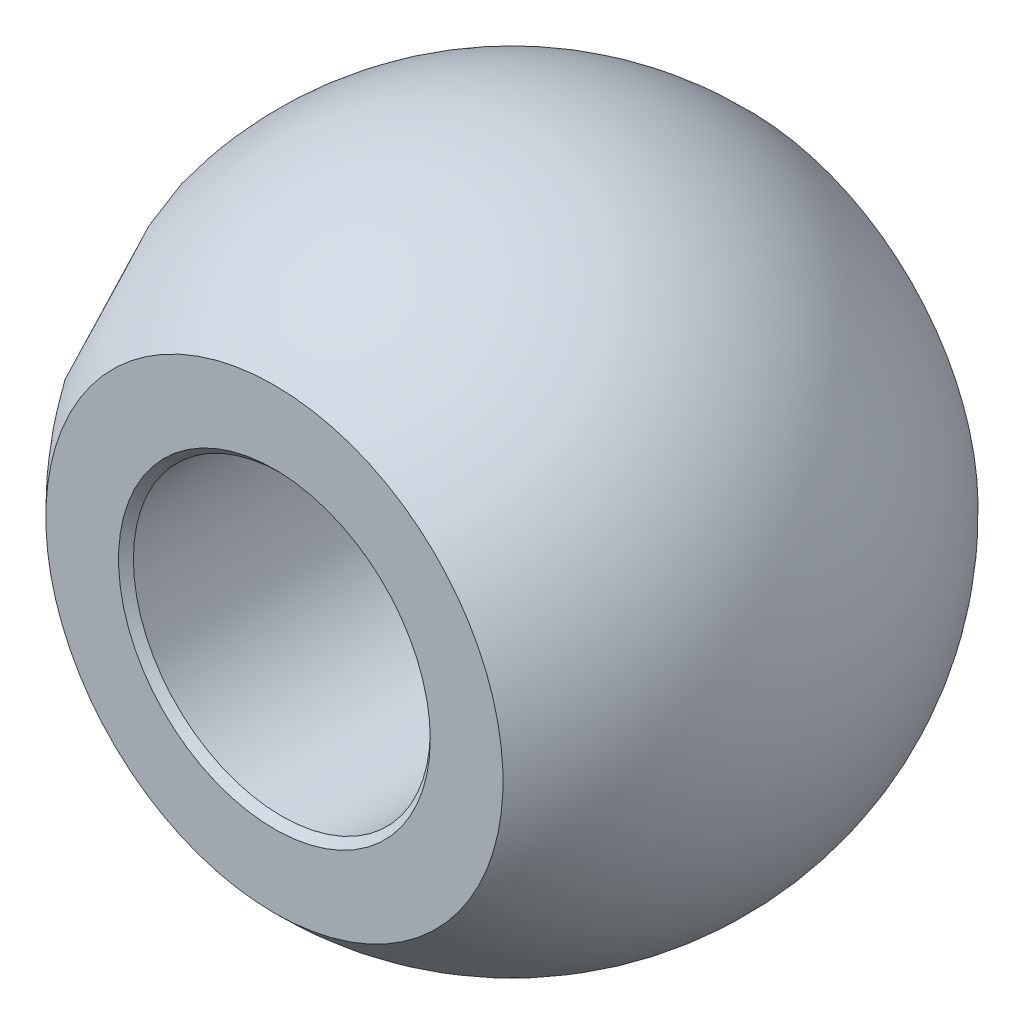
ISO-10303-21;
HEADER;
FILE_DESCRIPTION(('STEP AP214'),'2;1');
FILE_NAME('part.step','',(''),(''),'','','');
FILE_SCHEMA(('AUTOMOTIVE_DESIGN { 1 0 10303 214 1 1 1 1 }'));
ENDSEC;
DATA;
#1=APPLICATION_CONTEXT('core data for automotive mechanical design processes');
#2=APPLICATION_PROTOCOL_DEFINITION('international standard','automotive_design',2000,#1);
#3=PRODUCT_CONTEXT('',#1,'mechanical');
#4=PRODUCT('Part','Part','',(#3));
#5=PRODUCT_RELATED_PRODUCT_CATEGORY('part','',(#4));
#6=PRODUCT_DEFINITION_FORMATION('','',#4);
#7=PRODUCT_DEFINITION_CONTEXT('part definition',#1,'design');
#8=PRODUCT_DEFINITION('design','',#6,#7);
#9=PRODUCT_DEFINITION_SHAPE('','',#8);
#10=(LENGTH_UNIT() NAMED_UNIT(*) SI_UNIT(.MILLI.,.METRE.));
#11=(NAMED_UNIT(*) PLANE_ANGLE_UNIT() SI_UNIT($,.RADIAN.));
#12=(NAMED_UNIT(*) SI_UNIT($,.STERADIAN.) SOLID_ANGLE_UNIT());
#13=UNCERTAINTY_MEASURE_WITH_UNIT(LENGTH_MEASURE(1.E-05),#10,'distance_accuracy_value','');
#14=(GEOMETRIC_REPRESENTATION_CONTEXT(3) GLOBAL_UNCERTAINTY_ASSIGNED_CONTEXT((#13)) GLOBAL_UNIT_ASSIGNED_CONTEXT((#10,
#11,#12)) REPRESENTATION_CONTEXT('',''));
#15=CARTESIAN_POINT('',(0.,0.,0.));
#16=DIRECTION('',(0.,0.,1.));
#17=DIRECTION('',(1.,0.,0.));
#18=AXIS2_PLACEMENT_3D('',#15,#16,#17);
#19=CARTESIAN_POINT('',(0.,0.,4.));
#20=DIRECTION('',(0.,0.,1.));
#21=DIRECTION('',(1.,0.,0.));
#22=AXIS2_PLACEMENT_3D('',#19,#20,#21);
#23=CYLINDRICAL_SURFACE('',#22,2.5);
#24=CARTESIAN_POINT('',(0.,0.,3.87499999993679));
#25=DIRECTION('',(0.,0.,1.));
#26=DIRECTION('',(1.,0.,0.));
#27=AXIS2_PLACEMENT_3D('',#24,#25,#26);
#28=CIRCLE('',#27,2.49999999999773);
#29=CARTESIAN_POINT('',(2.49999999999773,0.,3.87499999993679));
#30=VERTEX_POINT('',#29);
#31=EDGE_CURVE('E42',#30,#30,#28,.T.);
#32=ORIENTED_EDGE('',*,*,#31,.T.);
#33=EDGE_LOOP('',(#32));
#34=FACE_BOUND('',#33,.T.);
#35=CARTESIAN_POINT('',(0.,0.,-3.87499999993679));
#36=DIRECTION('',(0.,0.,-1.));
#37=DIRECTION('',(-1.,0.,0.));
#38=AXIS2_PLACEMENT_3D('',#35,#36,#37);
#39=CIRCLE('',#38,2.49999999999773);
#40=CARTESIAN_POINT('',(-2.49999999999773,0.,-3.87499999993679));
#41=VERTEX_POINT('',#40);
#42=EDGE_CURVE('E38',#41,#41,#39,.T.);
#43=ORIENTED_EDGE('',*,*,#42,.T.);
#44=EDGE_LOOP('',(#43));
#45=FACE_BOUND('',#44,.T.);
#46=ADVANCED_FACE('F16',(#34,#45),#23,.F.);
#47=CARTESIAN_POINT('',(0.,0.,4.00000000007594));
#48=DIRECTION('',(0.,0.,1.));
#49=DIRECTION('',(1.,0.,0.));
#50=AXIS2_PLACEMENT_3D('',#47,#48,#49);
#51=CONICAL_SURFACE('',#50,2.62499999990951,0.785398162487954);
#52=ORIENTED_EDGE('',*,*,#31,.F.);
#53=EDGE_LOOP('',(#52));
#54=FACE_BOUND('',#53,.T.);
#55=CARTESIAN_POINT('',(0.,0.,4.00000000007594));
#56=DIRECTION('',(0.,0.,1.));
#57=DIRECTION('',(1.,0.,0.));
#58=AXIS2_PLACEMENT_3D('',#55,#56,#57);
#59=CIRCLE('',#58,2.62499999990951);
#60=CARTESIAN_POINT('',(2.62499999990951,0.,4.00000000007594));
#61=VERTEX_POINT('',#60);
#62=EDGE_CURVE('E20',#61,#61,#59,.F.);
#63=ORIENTED_EDGE('',*,*,#62,.F.);
#64=EDGE_LOOP('',(#63));
#65=FACE_BOUND('',#64,.T.);
#66=ADVANCED_FACE('F52',(#54,#65),#51,.F.);
#67=CARTESIAN_POINT('',(0.,0.,-4.00000000007594));
#68=DIRECTION('',(0.,0.,-1.));
#69=DIRECTION('',(-1.,0.,0.));
#70=AXIS2_PLACEMENT_3D('',#67,#68,#69);
#71=CONICAL_SURFACE('',#70,2.62499999990951,0.785398162487954);
#72=ORIENTED_EDGE('',*,*,#42,.F.);
#73=EDGE_LOOP('',(#72));
#74=FACE_BOUND('',#73,.T.);
#75=CARTESIAN_POINT('',(0.,0.,-4.00000000007594));
#76=DIRECTION('',(0.,0.,-1.));
#77=DIRECTION('',(-1.,0.,0.));
#78=AXIS2_PLACEMENT_3D('',#75,#76,#77);
#79=CIRCLE('',#78,2.62499999990951);
#80=CARTESIAN_POINT('',(-2.62499999990951,0.,-4.00000000007594));
#81=VERTEX_POINT('',#80);
#82=EDGE_CURVE('E29',#81,#81,#79,.F.);
#83=ORIENTED_EDGE('',*,*,#82,.F.);
#84=EDGE_LOOP('',(#83));
#85=FACE_BOUND('',#84,.T.);
#86=ADVANCED_FACE('F55',(#74,#85),#71,.F.);
#87=CARTESIAN_POINT('',(3.2375,0.,4.));
#88=DIRECTION('',(0.,0.,1.));
#89=DIRECTION('',(1.,0.,0.));
#90=AXIS2_PLACEMENT_3D('',#87,#88,#89);
#91=PLANE('',#90);
#92=ORIENTED_EDGE('',*,*,#62,.T.);
#93=EDGE_LOOP('',(#92));
#94=FACE_BOUND('',#93,.T.);
#95=CARTESIAN_POINT('',(1.20021180494145E-13,0.,4.));
#96=DIRECTION('',(0.,0.,1.));
#97=DIRECTION('',(1.,0.,0.));
#98=AXIS2_PLACEMENT_3D('',#95,#96,#97);
#99=CIRCLE('',#98,3.85000000000005);
#100=CARTESIAN_POINT('',(-3.09603122574186,2.28846906232771,4.));
#101=VERTEX_POINT('',#100);
#102=EDGE_CURVE('E24',#101,#101,#99,.F.);
#103=ORIENTED_EDGE('',*,*,#102,.F.);
#104=EDGE_LOOP('',(#103));
#105=FACE_BOUND('',#104,.T.);
#106=ADVANCED_FACE('F62',(#94,#105),#91,.T.);
#107=CARTESIAN_POINT('',(3.2375,0.,-4.));
#108=DIRECTION('',(0.,0.,-1.));
#109=DIRECTION('',(-1.,0.,0.));
#110=AXIS2_PLACEMENT_3D('',#107,#108,#109);
#111=PLANE('',#110);
#112=ORIENTED_EDGE('',*,*,#82,.T.);
#113=EDGE_LOOP('',(#112));
#114=FACE_BOUND('',#113,.T.);
#115=CARTESIAN_POINT('',(1.20021180494145E-13,0.,-4.));
#116=DIRECTION('',(0.,0.,-1.));
#117=DIRECTION('',(-1.,0.,0.));
#118=AXIS2_PLACEMENT_3D('',#115,#116,#117);
#119=CIRCLE('',#118,3.85000000000005);
#120=CARTESIAN_POINT('',(-1.65949466090485,-3.4739858189734,-4.));
#121=VERTEX_POINT('',#120);
#122=EDGE_CURVE('E10',#121,#121,#119,.F.);
#123=ORIENTED_EDGE('',*,*,#122,.F.);
#124=EDGE_LOOP('',(#123));
#125=FACE_BOUND('',#124,.T.);
#126=ADVANCED_FACE('F66',(#114,#125),#111,.T.);
#127=CARTESIAN_POINT('',(1.20021180494145E-13,0.,0.));
#128=DIRECTION('',(0.282924734195512,0.626301606135669,0.726429551252067));
#129=DIRECTION('',(-0.939271699416317,0.0275520774515117,0.34206659834554));
#130=AXIS2_PLACEMENT_3D('',#127,#128,#129);
#131=SPHERICAL_SURFACE('',#130,5.5518015094202);
#132=CARTESIAN_POINT('',(1.20021180494145E-13,0.,0.));
#133=DIRECTION('',(0.,0.,1.));
#134=DIRECTION('',(1.,0.,0.));
#135=AXIS2_PLACEMENT_3D('',#132,#133,#134);
#136=SPHERICAL_SURFACE('',#135,5.5518015094202);
#137=CARTESIAN_POINT('',(-3.09603122574186,2.28846906232771,4.));
#138=CARTESIAN_POINT('',(-3.19998646062144,2.22763184947655,3.95435465459594));
#139=CARTESIAN_POINT('',(-3.30143260323115,2.16494101472646,3.90546893304671));
#140=CARTESIAN_POINT('',(-3.49883640371181,2.0361686372723,3.8014772277288));
#141=CARTESIAN_POINT('',(-3.59479406158274,1.97008709456824,3.74637124396012));
#142=CARTESIAN_POINT('',(-3.7807505923868,1.83484983705009,3.6301995042742));
#143=CARTESIAN_POINT('',(-3.87074946531992,1.765694122236,3.56913374835695));
#144=CARTESIAN_POINT('',(-4.04435410367741,1.62464434296757,3.44133988638448));
#145=CARTESIAN_POINT('',(-4.12795986910177,1.55275027851323,3.37461178032925));
#146=CARTESIAN_POINT('',(-4.2883730208147,1.40657170424718,3.23581589785155));
#147=CARTESIAN_POINT('',(-4.36518040710326,1.33228719443547,3.16374812142907));
#148=CARTESIAN_POINT('',(-4.51162496198778,1.18168752556449,3.01462201530399));
#149=CARTESIAN_POINT('',(-4.58126213058374,1.10537236650522,2.93756368560139));
#150=CARTESIAN_POINT('',(-4.71302899693808,0.951080944208363,2.77882960192891));
#151=CARTESIAN_POINT('',(-4.77515869469646,0.873104680970781,2.69715384795904));
#152=CARTESIAN_POINT('',(-4.89160975853762,0.715868662110854,2.52958044665851));
#153=CARTESIAN_POINT('',(-4.94593112462041,0.636608906488509,2.44368279932786));
#154=CARTESIAN_POINT('',(-5.04650246697746,0.477189724001898,2.26808157595886));
#155=CARTESIAN_POINT('',(-5.09275244325173,0.39703029713763,2.17837799992051));
#156=CARTESIAN_POINT('',(-5.17695703691872,0.23619995167645,1.99559931732509));
#157=CARTESIAN_POINT('',(-5.21491165431143,0.155529033079537,1.90252421076803));
#158=CARTESIAN_POINT('',(-5.28234173145032,-0.00593363982968194,1.71345319146066));
#159=CARTESIAN_POINT('',(-5.31181719119651,-0.0867253941419882,1.61745727871036));
#160=CARTESIAN_POINT('',(-5.36214621554286,-0.24803849719012,1.42300951582062));
#161=CARTESIAN_POINT('',(-5.38299978014303,-0.328559845925945,1.32455766568119));
#162=CARTESIAN_POINT('',(-5.41598402894242,-0.488942206023655,1.12567478985542));
#163=CARTESIAN_POINT('',(-5.42811471314164,-0.56880321738554,1.02524376416909));
#164=CARTESIAN_POINT('',(-5.44359445722318,-0.727478168672074,0.822888883441031));
#165=CARTESIAN_POINT('',(-5.4469435171055,-0.806292108596724,0.720965028399308));
#166=CARTESIAN_POINT('',(-5.44484379443164,-0.962491253484447,0.516118064306998));
#167=CARTESIAN_POINT('',(-5.43939501187547,-1.03987645844752,0.413194955256411));
#168=CARTESIAN_POINT('',(-5.41972599053975,-1.19284338866348,0.206847897470549));
#169=CARTESIAN_POINT('',(-5.4055057517602,-1.26842511391636,0.103423948735274));
#170=CARTESIAN_POINT('',(-5.36836268075069,-1.41741907347462,-0.103423948735275));
#171=CARTESIAN_POINT('',(-5.34543984852072,-1.49083130777999,-0.20684789747055));
#172=CARTESIAN_POINT('',(-5.29100259646746,-1.6351307801591,-0.413194955256412));
#173=CARTESIAN_POINT('',(-5.25948817664417,-1.70601801823283,-0.516118064306999));
#174=CARTESIAN_POINT('',(-5.18802036078941,-1.84492422038347,-0.720965028399309));
#175=CARTESIAN_POINT('',(-5.14806696475795,-1.91294318446037,-0.822888883441032));
#176=CARTESIAN_POINT('',(-5.05991467436664,-2.04578345072546,-1.02524376416909));
#177=CARTESIAN_POINT('',(-5.01171578000679,-2.11060475291365,-1.12567478985542));
#178=CARTESIAN_POINT('',(-4.90730590039649,-2.23673579246829,-1.32455766568119));
#179=CARTESIAN_POINT('',(-4.85109491514603,-2.29804552983474,-1.42300951582062));
#180=CARTESIAN_POINT('',(-4.73093306046421,-2.41685654189212,-1.61745727871036));
#181=CARTESIAN_POINT('',(-4.66698219103285,-2.47435781658304,-1.71345319146066));
#182=CARTESIAN_POINT('',(-4.53165025574744,-2.5852734482039,-1.90252421076803));
#183=CARTESIAN_POINT('',(-4.4602691898934,-2.63868780513383,-1.99559931732509));
#184=CARTESIAN_POINT('',(-4.31042253102115,-2.74117093760259,-2.17837799992051));
#185=CARTESIAN_POINT('',(-4.23195693800295,-2.79023971314142,-2.26808157595886));
#186=CARTESIAN_POINT('',(-4.06832120109597,-2.88379406234609,-2.44368279932787));
#187=CARTESIAN_POINT('',(-3.9831510572072,-2.92827963601194,-2.52958044665851));
#188=CARTESIAN_POINT('',(-3.80651866380047,-3.01245215822712,-2.69715384795904));
#189=CARTESIAN_POINT('',(-3.7150564142825,-3.05213910677645,-2.77882960192891));
#190=CARTESIAN_POINT('',(-3.5262827191078,-3.12652218330143,-2.93756368560139));
#191=CARTESIAN_POINT('',(-3.42897127345108,-3.16121831127708,-3.01462201530399));
#192=CARTESIAN_POINT('',(-3.22897044251145,-3.22545175694857,-3.16374812142907));
#193=CARTESIAN_POINT('',(-3.12628105722854,-3.25498907464441,-3.23581589785155));
#194=CARTESIAN_POINT('',(-2.91602156545861,-3.3087617530004,-3.37461178032925));
#195=CARTESIAN_POINT('',(-2.80845145897157,-3.33299711366055,-3.44133988638448));
#196=CARTESIAN_POINT('',(-2.58895168174279,-3.37604892532301,-3.56913374835695));
#197=CARTESIAN_POINT('',(-2.47702201100104,-3.39486537632534,-3.6301995042742));
#198=CARTESIAN_POINT('',(-2.24934424223209,-3.42698672091278,-3.74637124396012));
#199=CARTESIAN_POINT('',(-2.1335961442049,-3.44029161449791,-3.8014772277288));
#200=CARTESIAN_POINT('',(-1.89884537194201,-3.46133111452475,-3.90546893304671));
#201=CARTESIAN_POINT('',(-1.77984269770632,-3.46906572096648,-3.95435465459594));
#202=CARTESIAN_POINT('',(-1.65949466090485,-3.4739858189734,-4.));
#203=B_SPLINE_CURVE_WITH_KNOTS('',3,(#137,#138,#139,#140,#141,#142,#143,#144,#145,#146,#147,
#148,#149,#150,#151,#152,#153,#154,#155,#156,#157,#158,#159,#160,#161,#162,#163,#164,#165,#166,
#167,#168,#169,#170,#171,#172,#173,#174,#175,#176,#177,#178,#179,#180,#181,#182,#183,#184,#185,
#186,#187,#188,#189,#190,#191,#192,#193,#194,#195,#196,#197,#198,#199,#200,#201,#202),
.UNSPECIFIED.,.F.,.F.,(4,2,2,2,2,2,2,2,2,2,2,2,2,2,2,2,2,2,2,2,2,2,2,2,2,2,2,2,2,2,2,2,4),(0.,
0.386342725972436,0.772685451944871,1.15902817791731,1.54537090388974,1.93171362986218,
2.31805635583461,2.70439908180705,3.09074180777949,3.47708453375192,3.86342725972436,
4.24976998569679,4.63611271166923,5.02245543764166,5.4087981636141,5.79514088958654,
6.18148361555897,6.56782634153141,6.95416906750384,7.34051179347628,7.72685451944871,
8.11319724542115,8.49953997139358,8.88588269736602,9.27222542333846,9.65856814931089,
10.0449108752833,10.4312536012558,10.8175963272282,11.2039390532006,11.5902817791731,
11.9766245051455,12.3629672311179),.UNSPECIFIED.);
#204=EDGE_CURVE('BSEAM18',#101,#121,#203,.T.);
#205=ORIENTED_EDGE('',*,*,#102,.T.);
#206=ORIENTED_EDGE('',*,*,#122,.T.);
#207=ORIENTED_EDGE('',*,*,#204,.T.);
#208=ORIENTED_EDGE('',*,*,#204,.F.);
#209=EDGE_LOOP('',(#205,#207,#206,#208));
#210=FACE_BOUND('',#209,.T.);
#211=ADVANCED_FACE('F18',(#210),#136,.T.);
#212=CLOSED_SHELL('',(#46,#66,#86,#106,#126,#211));
#213=MANIFOLD_SOLID_BREP('B1',#212);
#214=ADVANCED_BREP_SHAPE_REPRESENTATION('',(#18,#213),#14);
#215=SHAPE_DEFINITION_REPRESENTATION(#9,#214);
ENDSEC;
END-ISO-10303-21;
